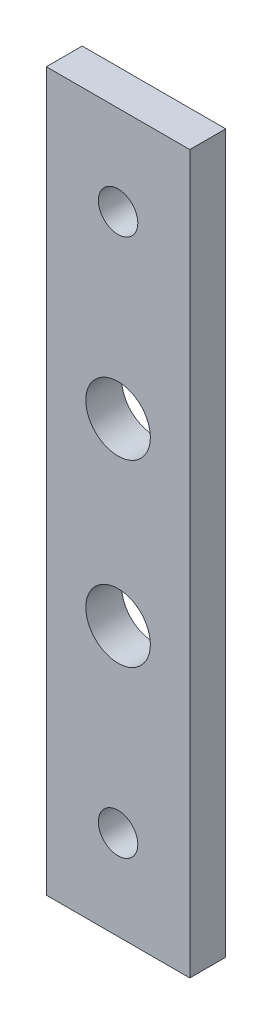
ISO-10303-21;
HEADER;
FILE_DESCRIPTION(('STEP AP214'),'2;1');
FILE_NAME('part.step','',(''),(''),'','','');
FILE_SCHEMA(('AUTOMOTIVE_DESIGN { 1 0 10303 214 1 1 1 1 }'));
ENDSEC;
DATA;
#1=APPLICATION_CONTEXT('core data for automotive mechanical design processes');
#2=APPLICATION_PROTOCOL_DEFINITION('international standard','automotive_design',2000,#1);
#3=PRODUCT_CONTEXT('',#1,'mechanical');
#4=PRODUCT('Part','Part','',(#3));
#5=PRODUCT_RELATED_PRODUCT_CATEGORY('part','',(#4));
#6=PRODUCT_DEFINITION_FORMATION('','',#4);
#7=PRODUCT_DEFINITION_CONTEXT('part definition',#1,'design');
#8=PRODUCT_DEFINITION('design','',#6,#7);
#9=PRODUCT_DEFINITION_SHAPE('','',#8);
#10=(LENGTH_UNIT() NAMED_UNIT(*) SI_UNIT(.MILLI.,.METRE.));
#11=(NAMED_UNIT(*) PLANE_ANGLE_UNIT() SI_UNIT($,.RADIAN.));
#12=(NAMED_UNIT(*) SI_UNIT($,.STERADIAN.) SOLID_ANGLE_UNIT());
#13=UNCERTAINTY_MEASURE_WITH_UNIT(LENGTH_MEASURE(1.E-05),#10,'distance_accuracy_value','');
#14=(GEOMETRIC_REPRESENTATION_CONTEXT(3) GLOBAL_UNCERTAINTY_ASSIGNED_CONTEXT((#13)) GLOBAL_UNIT_ASSIGNED_CONTEXT((#10,
#11,#12)) REPRESENTATION_CONTEXT('',''));
#15=CARTESIAN_POINT('',(0.,0.,0.));
#16=DIRECTION('',(0.,0.,1.));
#17=DIRECTION('',(1.,0.,0.));
#18=AXIS2_PLACEMENT_3D('',#15,#16,#17);
#19=CARTESIAN_POINT('',(0.,0.,-5.));
#20=DIRECTION('',(0.,-1.,0.));
#21=DIRECTION('',(0.,0.,-1.));
#22=AXIS2_PLACEMENT_3D('',#19,#20,#21);
#23=PLANE('',#22);
#24=DIRECTION('',(1.,0.,0.));
#25=VECTOR('',#24,1.);
#26=CARTESIAN_POINT('',(0.,0.,0.));
#27=LINE('',#26,#25);
#28=CARTESIAN_POINT('',(0.,0.,0.));
#29=VERTEX_POINT('',#28);
#30=CARTESIAN_POINT('',(20.,0.,0.));
#31=VERTEX_POINT('',#30);
#32=EDGE_CURVE('E120',#29,#31,#27,.T.);
#33=ORIENTED_EDGE('',*,*,#32,.F.);
#34=DIRECTION('',(0.,0.,1.));
#35=VECTOR('',#34,1.);
#36=CARTESIAN_POINT('',(0.,0.,-5.));
#37=LINE('',#36,#35);
#38=CARTESIAN_POINT('',(0.,0.,-5.));
#39=VERTEX_POINT('',#38);
#40=EDGE_CURVE('E11',#39,#29,#37,.T.);
#41=ORIENTED_EDGE('',*,*,#40,.F.);
#42=DIRECTION('',(1.,0.,0.));
#43=VECTOR('',#42,1.);
#44=CARTESIAN_POINT('',(0.,0.,-5.));
#45=LINE('',#44,#43);
#46=CARTESIAN_POINT('',(20.,0.,-5.));
#47=VERTEX_POINT('',#46);
#48=EDGE_CURVE('E101',#39,#47,#45,.T.);
#49=ORIENTED_EDGE('',*,*,#48,.T.);
#50=DIRECTION('',(0.,0.,1.));
#51=VECTOR('',#50,1.);
#52=CARTESIAN_POINT('',(20.,0.,-5.));
#53=LINE('',#52,#51);
#54=EDGE_CURVE('E43',#47,#31,#53,.T.);
#55=ORIENTED_EDGE('',*,*,#54,.T.);
#56=EDGE_LOOP('',(#33,#41,#49,#55));
#57=FACE_BOUND('',#56,.T.);
#58=ADVANCED_FACE('F39',(#57),#23,.T.);
#59=CARTESIAN_POINT('',(0.,0.,-5.));
#60=DIRECTION('',(1.,0.,0.));
#61=DIRECTION('',(0.,0.,-1.));
#62=AXIS2_PLACEMENT_3D('',#59,#60,#61);
#63=PLANE('',#62);
#64=DIRECTION('',(0.,1.,0.));
#65=VECTOR('',#64,1.);
#66=CARTESIAN_POINT('',(0.,0.,0.));
#67=LINE('',#66,#65);
#68=CARTESIAN_POINT('',(0.,100.,0.));
#69=VERTEX_POINT('',#68);
#70=EDGE_CURVE('E126',#29,#69,#67,.T.);
#71=ORIENTED_EDGE('',*,*,#70,.T.);
#72=DIRECTION('',(0.,0.,1.));
#73=VECTOR('',#72,1.);
#74=CARTESIAN_POINT('',(0.,100.,-5.));
#75=LINE('',#74,#73);
#76=CARTESIAN_POINT('',(0.,100.,-5.));
#77=VERTEX_POINT('',#76);
#78=EDGE_CURVE('E49',#77,#69,#75,.T.);
#79=ORIENTED_EDGE('',*,*,#78,.F.);
#80=DIRECTION('',(0.,1.,0.));
#81=VECTOR('',#80,1.);
#82=CARTESIAN_POINT('',(0.,0.,-5.));
#83=LINE('',#82,#81);
#84=EDGE_CURVE('E94',#39,#77,#83,.T.);
#85=ORIENTED_EDGE('',*,*,#84,.F.);
#86=ORIENTED_EDGE('',*,*,#40,.T.);
#87=EDGE_LOOP('',(#71,#79,#85,#86));
#88=FACE_BOUND('',#87,.T.);
#89=ADVANCED_FACE('F135',(#88),#63,.F.);
#90=CARTESIAN_POINT('',(0.,100.,-5.));
#91=DIRECTION('',(0.,-1.,0.));
#92=DIRECTION('',(0.,0.,-1.));
#93=AXIS2_PLACEMENT_3D('',#90,#91,#92);
#94=PLANE('',#93);
#95=DIRECTION('',(1.,0.,0.));
#96=VECTOR('',#95,1.);
#97=CARTESIAN_POINT('',(0.,100.,0.));
#98=LINE('',#97,#96);
#99=CARTESIAN_POINT('',(20.,100.,0.));
#100=VERTEX_POINT('',#99);
#101=EDGE_CURVE('E74',#69,#100,#98,.T.);
#102=ORIENTED_EDGE('',*,*,#101,.T.);
#103=DIRECTION('',(0.,0.,1.));
#104=VECTOR('',#103,1.);
#105=CARTESIAN_POINT('',(20.,100.,-5.));
#106=LINE('',#105,#104);
#107=CARTESIAN_POINT('',(20.,100.,-5.));
#108=VERTEX_POINT('',#107);
#109=EDGE_CURVE('E98',#108,#100,#106,.T.);
#110=ORIENTED_EDGE('',*,*,#109,.F.);
#111=DIRECTION('',(1.,0.,0.));
#112=VECTOR('',#111,1.);
#113=CARTESIAN_POINT('',(0.,100.,-5.));
#114=LINE('',#113,#112);
#115=EDGE_CURVE('E88',#77,#108,#114,.T.);
#116=ORIENTED_EDGE('',*,*,#115,.F.);
#117=ORIENTED_EDGE('',*,*,#78,.T.);
#118=EDGE_LOOP('',(#102,#110,#116,#117));
#119=FACE_BOUND('',#118,.T.);
#120=ADVANCED_FACE('F99',(#119),#94,.F.);
#121=CARTESIAN_POINT('',(10.,12.5,-5.));
#122=DIRECTION('',(0.,0.,1.));
#123=DIRECTION('',(1.,0.,0.));
#124=AXIS2_PLACEMENT_3D('',#121,#122,#123);
#125=CYLINDRICAL_SURFACE('',#124,2.75);
#126=CARTESIAN_POINT('',(10.,12.5,-5.));
#127=DIRECTION('',(0.,0.,1.));
#128=DIRECTION('',(1.,0.,0.));
#129=AXIS2_PLACEMENT_3D('',#126,#127,#128);
#130=CIRCLE('',#129,2.75);
#131=CARTESIAN_POINT('',(12.75,12.5,-5.));
#132=VERTEX_POINT('',#131);
#133=EDGE_CURVE('E108',#132,#132,#130,.T.);
#134=ORIENTED_EDGE('',*,*,#133,.F.);
#135=EDGE_LOOP('',(#134));
#136=FACE_BOUND('',#135,.T.);
#137=CARTESIAN_POINT('',(10.,12.5,0.));
#138=DIRECTION('',(0.,0.,1.));
#139=DIRECTION('',(1.,0.,0.));
#140=AXIS2_PLACEMENT_3D('',#137,#138,#139);
#141=CIRCLE('',#140,2.75);
#142=CARTESIAN_POINT('',(12.75,12.5,0.));
#143=VERTEX_POINT('',#142);
#144=EDGE_CURVE('E128',#143,#143,#141,.T.);
#145=ORIENTED_EDGE('',*,*,#144,.T.);
#146=EDGE_LOOP('',(#145));
#147=FACE_BOUND('',#146,.T.);
#148=ADVANCED_FACE('F155',(#136,#147),#125,.F.);
#149=CARTESIAN_POINT('',(20.,0.,-5.));
#150=DIRECTION('',(1.,0.,0.));
#151=DIRECTION('',(0.,0.,-1.));
#152=AXIS2_PLACEMENT_3D('',#149,#150,#151);
#153=PLANE('',#152);
#154=DIRECTION('',(0.,1.,0.));
#155=VECTOR('',#154,1.);
#156=CARTESIAN_POINT('',(20.,0.,0.));
#157=LINE('',#156,#155);
#158=EDGE_CURVE('E123',#31,#100,#157,.T.);
#159=ORIENTED_EDGE('',*,*,#158,.F.);
#160=ORIENTED_EDGE('',*,*,#54,.F.);
#161=DIRECTION('',(0.,1.,0.));
#162=VECTOR('',#161,1.);
#163=CARTESIAN_POINT('',(20.,0.,-5.));
#164=LINE('',#163,#162);
#165=EDGE_CURVE('E93',#47,#108,#164,.T.);
#166=ORIENTED_EDGE('',*,*,#165,.T.);
#167=ORIENTED_EDGE('',*,*,#109,.T.);
#168=EDGE_LOOP('',(#159,#160,#166,#167));
#169=FACE_BOUND('',#168,.T.);
#170=ADVANCED_FACE('F100',(#169),#153,.T.);
#171=CARTESIAN_POINT('',(10.,62.5,-5.));
#172=DIRECTION('',(0.,0.,1.));
#173=DIRECTION('',(1.,0.,0.));
#174=AXIS2_PLACEMENT_3D('',#171,#172,#173);
#175=CYLINDRICAL_SURFACE('',#174,4.5);
#176=CARTESIAN_POINT('',(10.,62.5,-5.));
#177=DIRECTION('',(0.,0.,1.));
#178=DIRECTION('',(1.,0.,0.));
#179=AXIS2_PLACEMENT_3D('',#176,#177,#178);
#180=CIRCLE('',#179,4.5);
#181=CARTESIAN_POINT('',(14.5,62.5,-5.));
#182=VERTEX_POINT('',#181);
#183=EDGE_CURVE('E103',#182,#182,#180,.T.);
#184=ORIENTED_EDGE('',*,*,#183,.F.);
#185=EDGE_LOOP('',(#184));
#186=FACE_BOUND('',#185,.T.);
#187=CARTESIAN_POINT('',(10.,62.5,0.));
#188=DIRECTION('',(0.,0.,1.));
#189=DIRECTION('',(1.,0.,0.));
#190=AXIS2_PLACEMENT_3D('',#187,#188,#189);
#191=CIRCLE('',#190,4.5);
#192=CARTESIAN_POINT('',(14.5,62.5,0.));
#193=VERTEX_POINT('',#192);
#194=EDGE_CURVE('E117',#193,#193,#191,.T.);
#195=ORIENTED_EDGE('',*,*,#194,.T.);
#196=EDGE_LOOP('',(#195));
#197=FACE_BOUND('',#196,.T.);
#198=ADVANCED_FACE('F146',(#186,#197),#175,.F.);
#199=CARTESIAN_POINT('',(10.,37.5,-5.));
#200=DIRECTION('',(0.,0.,1.));
#201=DIRECTION('',(1.,0.,0.));
#202=AXIS2_PLACEMENT_3D('',#199,#200,#201);
#203=CYLINDRICAL_SURFACE('',#202,4.5);
#204=CARTESIAN_POINT('',(10.,37.5,-5.));
#205=DIRECTION('',(0.,0.,1.));
#206=DIRECTION('',(1.,0.,0.));
#207=AXIS2_PLACEMENT_3D('',#204,#205,#206);
#208=CIRCLE('',#207,4.5);
#209=CARTESIAN_POINT('',(14.5,37.5,-5.));
#210=VERTEX_POINT('',#209);
#211=EDGE_CURVE('E133',#210,#210,#208,.T.);
#212=ORIENTED_EDGE('',*,*,#211,.F.);
#213=EDGE_LOOP('',(#212));
#214=FACE_BOUND('',#213,.T.);
#215=CARTESIAN_POINT('',(10.,37.5,0.));
#216=DIRECTION('',(0.,0.,1.));
#217=DIRECTION('',(1.,0.,0.));
#218=AXIS2_PLACEMENT_3D('',#215,#216,#217);
#219=CIRCLE('',#218,4.5);
#220=CARTESIAN_POINT('',(14.5,37.5,0.));
#221=VERTEX_POINT('',#220);
#222=EDGE_CURVE('E114',#221,#221,#219,.T.);
#223=ORIENTED_EDGE('',*,*,#222,.T.);
#224=EDGE_LOOP('',(#223));
#225=FACE_BOUND('',#224,.T.);
#226=ADVANCED_FACE('F41',(#214,#225),#203,.F.);
#227=CARTESIAN_POINT('',(10.,87.5,-5.));
#228=DIRECTION('',(0.,0.,1.));
#229=DIRECTION('',(1.,0.,0.));
#230=AXIS2_PLACEMENT_3D('',#227,#228,#229);
#231=CYLINDRICAL_SURFACE('',#230,2.75);
#232=CARTESIAN_POINT('',(10.,87.5,-5.));
#233=DIRECTION('',(0.,0.,1.));
#234=DIRECTION('',(1.,0.,0.));
#235=AXIS2_PLACEMENT_3D('',#232,#233,#234);
#236=CIRCLE('',#235,2.75);
#237=CARTESIAN_POINT('',(12.75,87.5,-5.));
#238=VERTEX_POINT('',#237);
#239=EDGE_CURVE('E111',#238,#238,#236,.F.);
#240=ORIENTED_EDGE('',*,*,#239,.T.);
#241=EDGE_LOOP('',(#240));
#242=FACE_BOUND('',#241,.T.);
#243=CARTESIAN_POINT('',(10.,87.5,0.));
#244=DIRECTION('',(0.,0.,1.));
#245=DIRECTION('',(1.,0.,0.));
#246=AXIS2_PLACEMENT_3D('',#243,#244,#245);
#247=CIRCLE('',#246,2.75);
#248=CARTESIAN_POINT('',(12.75,87.5,0.));
#249=VERTEX_POINT('',#248);
#250=EDGE_CURVE('E131',#249,#249,#247,.F.);
#251=ORIENTED_EDGE('',*,*,#250,.F.);
#252=EDGE_LOOP('',(#251));
#253=FACE_BOUND('',#252,.T.);
#254=ADVANCED_FACE('F153',(#242,#253),#231,.F.);
#255=CARTESIAN_POINT('',(0.,0.,-5.));
#256=DIRECTION('',(0.,0.,1.));
#257=DIRECTION('',(1.,0.,0.));
#258=AXIS2_PLACEMENT_3D('',#255,#256,#257);
#259=PLANE('',#258);
#260=ORIENTED_EDGE('',*,*,#211,.T.);
#261=EDGE_LOOP('',(#260));
#262=FACE_BOUND('',#261,.T.);
#263=ORIENTED_EDGE('',*,*,#183,.T.);
#264=EDGE_LOOP('',(#263));
#265=FACE_BOUND('',#264,.T.);
#266=ORIENTED_EDGE('',*,*,#48,.F.);
#267=ORIENTED_EDGE('',*,*,#84,.T.);
#268=ORIENTED_EDGE('',*,*,#115,.T.);
#269=ORIENTED_EDGE('',*,*,#165,.F.);
#270=EDGE_LOOP('',(#266,#267,#268,#269));
#271=FACE_BOUND('',#270,.T.);
#272=ORIENTED_EDGE('',*,*,#133,.T.);
#273=EDGE_LOOP('',(#272));
#274=FACE_BOUND('',#273,.T.);
#275=ORIENTED_EDGE('',*,*,#239,.F.);
#276=EDGE_LOOP('',(#275));
#277=FACE_BOUND('',#276,.T.);
#278=ADVANCED_FACE('F91',(#262,#265,#271,#274,#277),#259,.F.);
#279=CARTESIAN_POINT('',(0.,0.,0.));
#280=DIRECTION('',(0.,0.,1.));
#281=DIRECTION('',(1.,0.,0.));
#282=AXIS2_PLACEMENT_3D('',#279,#280,#281);
#283=PLANE('',#282);
#284=ORIENTED_EDGE('',*,*,#222,.F.);
#285=EDGE_LOOP('',(#284));
#286=FACE_BOUND('',#285,.T.);
#287=ORIENTED_EDGE('',*,*,#194,.F.);
#288=EDGE_LOOP('',(#287));
#289=FACE_BOUND('',#288,.T.);
#290=ORIENTED_EDGE('',*,*,#32,.T.);
#291=ORIENTED_EDGE('',*,*,#158,.T.);
#292=ORIENTED_EDGE('',*,*,#101,.F.);
#293=ORIENTED_EDGE('',*,*,#70,.F.);
#294=EDGE_LOOP('',(#290,#291,#292,#293));
#295=FACE_BOUND('',#294,.T.);
#296=ORIENTED_EDGE('',*,*,#144,.F.);
#297=EDGE_LOOP('',(#296));
#298=FACE_BOUND('',#297,.T.);
#299=ORIENTED_EDGE('',*,*,#250,.T.);
#300=EDGE_LOOP('',(#299));
#301=FACE_BOUND('',#300,.T.);
#302=ADVANCED_FACE('F136',(#286,#289,#295,#298,#301),#283,.T.);
#303=CLOSED_SHELL('',(#58,#89,#120,#148,#170,#198,#226,#254,#278,#302));
#304=MANIFOLD_SOLID_BREP('B2',#303);
#305=ADVANCED_BREP_SHAPE_REPRESENTATION('',(#18,#304),#14);
#306=SHAPE_DEFINITION_REPRESENTATION(#9,#305);
ENDSEC;
END-ISO-10303-21;
